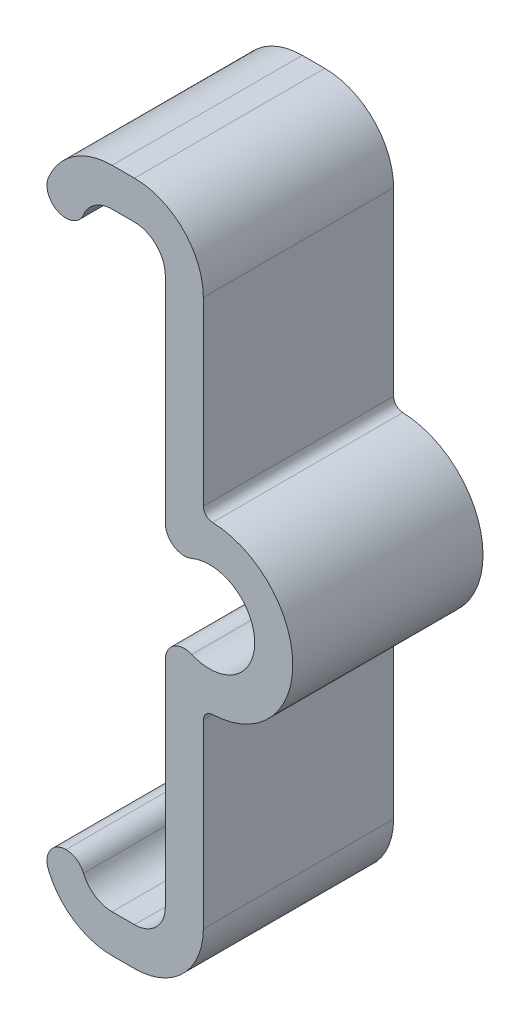
ISO-10303-21;
HEADER;
FILE_DESCRIPTION(('STEP AP214'),'2;1');
FILE_NAME('part.step','',(''),(''),'','','');
FILE_SCHEMA(('AUTOMOTIVE_DESIGN { 1 0 10303 214 1 1 1 1 }'));
ENDSEC;
DATA;
#1=APPLICATION_CONTEXT('core data for automotive mechanical design processes');
#2=APPLICATION_PROTOCOL_DEFINITION('international standard','automotive_design',2000,#1);
#3=PRODUCT_CONTEXT('',#1,'mechanical');
#4=PRODUCT('Part','Part','',(#3));
#5=PRODUCT_RELATED_PRODUCT_CATEGORY('part','',(#4));
#6=PRODUCT_DEFINITION_FORMATION('','',#4);
#7=PRODUCT_DEFINITION_CONTEXT('part definition',#1,'design');
#8=PRODUCT_DEFINITION('design','',#6,#7);
#9=PRODUCT_DEFINITION_SHAPE('','',#8);
#10=(LENGTH_UNIT() NAMED_UNIT(*) SI_UNIT(.MILLI.,.METRE.));
#11=(NAMED_UNIT(*) PLANE_ANGLE_UNIT() SI_UNIT($,.RADIAN.));
#12=(NAMED_UNIT(*) SI_UNIT($,.STERADIAN.) SOLID_ANGLE_UNIT());
#13=UNCERTAINTY_MEASURE_WITH_UNIT(LENGTH_MEASURE(1.E-05),#10,'distance_accuracy_value','');
#14=(GEOMETRIC_REPRESENTATION_CONTEXT(3) GLOBAL_UNCERTAINTY_ASSIGNED_CONTEXT((#13)) GLOBAL_UNIT_ASSIGNED_CONTEXT((#10,
#11,#12)) REPRESENTATION_CONTEXT('',''));
#15=CARTESIAN_POINT('',(0.,0.,0.));
#16=DIRECTION('',(0.,0.,1.));
#17=DIRECTION('',(1.,0.,0.));
#18=AXIS2_PLACEMENT_3D('',#15,#16,#17);
#19=CARTESIAN_POINT('',(0.,17.9899999999998,10.));
#20=DIRECTION('',(0.,-1.,0.));
#21=DIRECTION('',(1.,0.,0.));
#22=AXIS2_PLACEMENT_3D('',#19,#20,#21);
#23=PLANE('',#22);
#24=DIRECTION('',(-1.,0.,0.));
#25=VECTOR('',#24,1.);
#26=CARTESIAN_POINT('',(0.,17.9899999999998,0.));
#27=LINE('',#26,#25);
#28=CARTESIAN_POINT('',(-1.56999999999988,17.9899999999998,0.));
#29=VERTEX_POINT('',#28);
#30=CARTESIAN_POINT('',(-2.74800000000017,17.9899999999998,0.));
#31=VERTEX_POINT('',#30);
#32=EDGE_CURVE('E230',#29,#31,#27,.T.);
#33=ORIENTED_EDGE('',*,*,#32,.T.);
#34=DIRECTION('',(0.,0.,-1.));
#35=VECTOR('',#34,1.);
#36=CARTESIAN_POINT('',(-2.74800000000017,17.9899999999998,10.));
#37=LINE('',#36,#35);
#38=CARTESIAN_POINT('',(-2.74800000000017,17.9899999999998,10.));
#39=VERTEX_POINT('',#38);
#40=EDGE_CURVE('E213',#39,#31,#37,.T.);
#41=ORIENTED_EDGE('',*,*,#40,.F.);
#42=DIRECTION('',(-1.,0.,0.));
#43=VECTOR('',#42,1.);
#44=CARTESIAN_POINT('',(0.,17.9899999999998,10.));
#45=LINE('',#44,#43);
#46=CARTESIAN_POINT('',(-1.56999999999988,17.9899999999998,10.));
#47=VERTEX_POINT('',#46);
#48=EDGE_CURVE('E218',#47,#39,#45,.T.);
#49=ORIENTED_EDGE('',*,*,#48,.F.);
#50=DIRECTION('',(0.,0.,-1.));
#51=VECTOR('',#50,1.);
#52=CARTESIAN_POINT('',(-1.56999999999988,17.9899999999998,10.));
#53=LINE('',#52,#51);
#54=EDGE_CURVE('E342',#47,#29,#53,.T.);
#55=ORIENTED_EDGE('',*,*,#54,.T.);
#56=EDGE_LOOP('',(#33,#41,#49,#55));
#57=FACE_BOUND('',#56,.T.);
#58=ADVANCED_FACE('F35',(#57),#23,.F.);
#59=CARTESIAN_POINT('',(-2.74800000000055,14.37,10.));
#60=DIRECTION('',(0.,0.,-1.));
#61=DIRECTION('',(-1.,0.,0.));
#62=AXIS2_PLACEMENT_3D('',#59,#60,#61);
#63=CYLINDRICAL_SURFACE('',#62,3.61999999999977);
#64=CARTESIAN_POINT('',(-2.74800000000055,14.37,0.));
#65=DIRECTION('',(0.,0.,1.));
#66=DIRECTION('',(1.,0.,0.));
#67=AXIS2_PLACEMENT_3D('',#64,#65,#66);
#68=CIRCLE('',#67,3.61999999999977);
#69=CARTESIAN_POINT('',(-6.09394711033358,15.7516793893131,0.));
#70=VERTEX_POINT('',#69);
#71=EDGE_CURVE('E296',#31,#70,#68,.T.);
#72=ORIENTED_EDGE('',*,*,#71,.T.);
#73=DIRECTION('',(0.,0.,-1.));
#74=VECTOR('',#73,1.);
#75=CARTESIAN_POINT('',(-6.09394711033358,15.7516793893131,10.));
#76=LINE('',#75,#74);
#77=CARTESIAN_POINT('',(-6.09394711033358,15.7516793893131,10.));
#78=VERTEX_POINT('',#77);
#79=EDGE_CURVE('E216',#70,#78,#76,.F.);
#80=ORIENTED_EDGE('',*,*,#79,.T.);
#81=CARTESIAN_POINT('',(-2.74800000000055,14.37,10.));
#82=DIRECTION('',(0.,0.,1.));
#83=DIRECTION('',(1.,0.,0.));
#84=AXIS2_PLACEMENT_3D('',#81,#82,#83);
#85=CIRCLE('',#84,3.61999999999977);
#86=EDGE_CURVE('E208',#39,#78,#85,.T.);
#87=ORIENTED_EDGE('',*,*,#86,.F.);
#88=ORIENTED_EDGE('',*,*,#40,.T.);
#89=EDGE_LOOP('',(#72,#80,#87,#88));
#90=FACE_BOUND('',#89,.T.);
#91=ADVANCED_FACE('F211',(#90),#63,.T.);
#92=CARTESIAN_POINT('',(-2.74800000000056,14.37,10.));
#93=DIRECTION('',(0.,0.,-1.));
#94=DIRECTION('',(-1.,0.,0.));
#95=AXIS2_PLACEMENT_3D('',#92,#93,#94);
#96=CYLINDRICAL_SURFACE('',#95,1.61999999999978);
#97=CARTESIAN_POINT('',(-2.74800000000056,14.37,10.));
#98=DIRECTION('',(0.,0.,1.));
#99=DIRECTION('',(1.,0.,0.));
#100=AXIS2_PLACEMENT_3D('',#97,#98,#99);
#101=CIRCLE('',#100,1.61999999999978);
#102=CARTESIAN_POINT('',(-2.74800000000017,15.9899999999998,10.));
#103=VERTEX_POINT('',#102);
#104=CARTESIAN_POINT('',(-4.24535754661357,14.988320610687,10.));
#105=VERTEX_POINT('',#104);
#106=EDGE_CURVE('E217',#103,#105,#101,.T.);
#107=ORIENTED_EDGE('',*,*,#106,.T.);
#108=DIRECTION('',(0.,0.,-1.));
#109=VECTOR('',#108,1.);
#110=CARTESIAN_POINT('',(-4.24535754661357,14.988320610687,10.));
#111=LINE('',#110,#109);
#112=CARTESIAN_POINT('',(-4.24535754661357,14.988320610687,0.));
#113=VERTEX_POINT('',#112);
#114=EDGE_CURVE('E288',#105,#113,#111,.T.);
#115=ORIENTED_EDGE('',*,*,#114,.T.);
#116=CARTESIAN_POINT('',(-2.74800000000056,14.37,0.));
#117=DIRECTION('',(0.,0.,1.));
#118=DIRECTION('',(1.,0.,0.));
#119=AXIS2_PLACEMENT_3D('',#116,#117,#118);
#120=CIRCLE('',#119,1.61999999999978);
#121=CARTESIAN_POINT('',(-2.74800000000017,15.9899999999998,0.));
#122=VERTEX_POINT('',#121);
#123=EDGE_CURVE('E381',#122,#113,#120,.T.);
#124=ORIENTED_EDGE('',*,*,#123,.F.);
#125=DIRECTION('',(0.,0.,-1.));
#126=VECTOR('',#125,1.);
#127=CARTESIAN_POINT('',(-2.74800000000017,15.9899999999998,10.));
#128=LINE('',#127,#126);
#129=EDGE_CURVE('E232',#103,#122,#128,.T.);
#130=ORIENTED_EDGE('',*,*,#129,.F.);
#131=EDGE_LOOP('',(#107,#115,#124,#130));
#132=FACE_BOUND('',#131,.T.);
#133=ADVANCED_FACE('F518',(#132),#96,.F.);
#134=CARTESIAN_POINT('',(-6.59312728916929E-13,15.9899999999999,10.));
#135=DIRECTION('',(0.,-1.,0.));
#136=DIRECTION('',(1.,0.,0.));
#137=AXIS2_PLACEMENT_3D('',#134,#135,#136);
#138=PLANE('',#137);
#139=DIRECTION('',(-1.,0.,0.));
#140=VECTOR('',#139,1.);
#141=CARTESIAN_POINT('',(-6.59312728916929E-13,15.9899999999999,0.));
#142=LINE('',#141,#140);
#143=CARTESIAN_POINT('',(-1.56999999999988,15.9899999999999,0.));
#144=VERTEX_POINT('',#143);
#145=EDGE_CURVE('E377',#144,#122,#142,.T.);
#146=ORIENTED_EDGE('',*,*,#145,.F.);
#147=DIRECTION('',(0.,0.,-1.));
#148=VECTOR('',#147,1.);
#149=CARTESIAN_POINT('',(-1.56999999999988,15.9899999999999,10.));
#150=LINE('',#149,#148);
#151=CARTESIAN_POINT('',(-1.56999999999988,15.9899999999999,10.));
#152=VERTEX_POINT('',#151);
#153=EDGE_CURVE('E237',#152,#144,#150,.T.);
#154=ORIENTED_EDGE('',*,*,#153,.F.);
#155=DIRECTION('',(-1.,0.,0.));
#156=VECTOR('',#155,1.);
#157=CARTESIAN_POINT('',(-6.59312728916929E-13,15.9899999999999,10.));
#158=LINE('',#157,#156);
#159=EDGE_CURVE('E427',#152,#103,#158,.T.);
#160=ORIENTED_EDGE('',*,*,#159,.T.);
#161=ORIENTED_EDGE('',*,*,#129,.T.);
#162=EDGE_LOOP('',(#146,#154,#160,#161));
#163=FACE_BOUND('',#162,.T.);
#164=ADVANCED_FACE('F378',(#163),#138,.T.);
#165=CARTESIAN_POINT('',(-1.56999999999988,14.37,10.));
#166=DIRECTION('',(0.,0.,-1.));
#167=DIRECTION('',(-1.,0.,0.));
#168=AXIS2_PLACEMENT_3D('',#165,#166,#167);
#169=CYLINDRICAL_SURFACE('',#168,1.61999999999985);
#170=CARTESIAN_POINT('',(-1.56999999999988,14.37,0.));
#171=DIRECTION('',(0.,0.,1.));
#172=DIRECTION('',(1.,0.,0.));
#173=AXIS2_PLACEMENT_3D('',#170,#171,#172);
#174=CIRCLE('',#173,1.61999999999985);
#175=CARTESIAN_POINT('',(0.05,14.3700000000001,0.));
#176=VERTEX_POINT('',#175);
#177=EDGE_CURVE('E370',#176,#144,#174,.T.);
#178=ORIENTED_EDGE('',*,*,#177,.F.);
#179=DIRECTION('',(0.,0.,-1.));
#180=VECTOR('',#179,1.);
#181=CARTESIAN_POINT('',(0.05,14.3700000000001,10.));
#182=LINE('',#181,#180);
#183=CARTESIAN_POINT('',(0.05,14.3700000000001,10.));
#184=VERTEX_POINT('',#183);
#185=EDGE_CURVE('E361',#184,#176,#182,.T.);
#186=ORIENTED_EDGE('',*,*,#185,.F.);
#187=CARTESIAN_POINT('',(-1.56999999999988,14.37,10.));
#188=DIRECTION('',(0.,0.,1.));
#189=DIRECTION('',(1.,0.,0.));
#190=AXIS2_PLACEMENT_3D('',#187,#188,#189);
#191=CIRCLE('',#190,1.61999999999985);
#192=EDGE_CURVE('E372',#184,#152,#191,.T.);
#193=ORIENTED_EDGE('',*,*,#192,.T.);
#194=ORIENTED_EDGE('',*,*,#153,.T.);
#195=EDGE_LOOP('',(#178,#186,#193,#194));
#196=FACE_BOUND('',#195,.T.);
#197=ADVANCED_FACE('F367',(#196),#169,.F.);
#198=CARTESIAN_POINT('',(0.0499999999999965,0.,10.));
#199=DIRECTION('',(-1.,0.,0.));
#200=DIRECTION('',(0.,-1.,0.));
#201=AXIS2_PLACEMENT_3D('',#198,#199,#200);
#202=PLANE('',#201);
#203=DIRECTION('',(0.,1.,0.));
#204=VECTOR('',#203,1.);
#205=CARTESIAN_POINT('',(0.0499999999999965,0.,0.));
#206=LINE('',#205,#204);
#207=CARTESIAN_POINT('',(0.0499999999999972,3.10402963903375,0.));
#208=VERTEX_POINT('',#207);
#209=EDGE_CURVE('E384',#208,#176,#206,.T.);
#210=ORIENTED_EDGE('',*,*,#209,.F.);
#211=DIRECTION('',(0.,0.,-1.));
#212=VECTOR('',#211,1.);
#213=CARTESIAN_POINT('',(0.0499999999999972,3.10402963903375,10.));
#214=LINE('',#213,#212);
#215=CARTESIAN_POINT('',(0.0499999999999972,3.10402963903375,10.));
#216=VERTEX_POINT('',#215);
#217=EDGE_CURVE('E253',#208,#216,#214,.F.);
#218=ORIENTED_EDGE('',*,*,#217,.T.);
#219=DIRECTION('',(0.,1.,0.));
#220=VECTOR('',#219,1.);
#221=CARTESIAN_POINT('',(0.0499999999999965,0.,10.));
#222=LINE('',#221,#220);
#223=EDGE_CURVE('E426',#216,#184,#222,.T.);
#224=ORIENTED_EDGE('',*,*,#223,.T.);
#225=ORIENTED_EDGE('',*,*,#185,.T.);
#226=EDGE_LOOP('',(#210,#218,#224,#225));
#227=FACE_BOUND('',#226,.T.);
#228=ADVANCED_FACE('F424',(#227),#202,.T.);
#229=CARTESIAN_POINT('',(2.375,0.,10.));
#230=DIRECTION('',(0.,0.,-1.));
#231=DIRECTION('',(-1.,0.,0.));
#232=AXIS2_PLACEMENT_3D('',#229,#230,#231);
#233=CYLINDRICAL_SURFACE('',#232,2.375);
#234=CARTESIAN_POINT('',(2.375,0.,0.));
#235=DIRECTION('',(0.,0.,1.));
#236=DIRECTION('',(1.,0.,0.));
#237=AXIS2_PLACEMENT_3D('',#234,#235,#236);
#238=CIRCLE('',#237,2.375);
#239=CARTESIAN_POINT('',(1.44259259259259,-2.18431715339412,0.));
#240=VERTEX_POINT('',#239);
#241=CARTESIAN_POINT('',(1.44259259259259,2.18431715339412,0.));
#242=VERTEX_POINT('',#241);
#243=EDGE_CURVE('E386',#240,#242,#238,.T.);
#244=ORIENTED_EDGE('',*,*,#243,.F.);
#245=DIRECTION('',(0.,0.,-1.));
#246=VECTOR('',#245,1.);
#247=CARTESIAN_POINT('',(1.44259259259259,-2.18431715339412,10.));
#248=LINE('',#247,#246);
#249=CARTESIAN_POINT('',(1.44259259259259,-2.18431715339412,10.));
#250=VERTEX_POINT('',#249);
#251=EDGE_CURVE('E247',#240,#250,#248,.F.);
#252=ORIENTED_EDGE('',*,*,#251,.T.);
#253=CARTESIAN_POINT('',(2.375,0.,10.));
#254=DIRECTION('',(0.,0.,1.));
#255=DIRECTION('',(1.,0.,0.));
#256=AXIS2_PLACEMENT_3D('',#253,#254,#255);
#257=CIRCLE('',#256,2.375);
#258=CARTESIAN_POINT('',(1.44259259259259,2.18431715339412,10.));
#259=VERTEX_POINT('',#258);
#260=EDGE_CURVE('E418',#250,#259,#257,.T.);
#261=ORIENTED_EDGE('',*,*,#260,.T.);
#262=DIRECTION('',(0.,0.,-1.));
#263=VECTOR('',#262,1.);
#264=CARTESIAN_POINT('',(1.44259259259259,2.18431715339412,10.));
#265=LINE('',#264,#263);
#266=EDGE_CURVE('E244',#259,#242,#265,.T.);
#267=ORIENTED_EDGE('',*,*,#266,.T.);
#268=EDGE_LOOP('',(#244,#252,#261,#267));
#269=FACE_BOUND('',#268,.T.);
#270=ADVANCED_FACE('F414',(#269),#233,.F.);
#271=CARTESIAN_POINT('',(0.0499999999999965,0.,10.));
#272=DIRECTION('',(-1.,0.,0.));
#273=DIRECTION('',(0.,-1.,0.));
#274=AXIS2_PLACEMENT_3D('',#271,#272,#273);
#275=PLANE('',#274);
#276=DIRECTION('',(0.,1.,0.));
#277=VECTOR('',#276,1.);
#278=CARTESIAN_POINT('',(0.0499999999999965,0.,10.));
#279=LINE('',#278,#277);
#280=CARTESIAN_POINT('',(0.049999999999993,-14.3700000000001,10.));
#281=VERTEX_POINT('',#280);
#282=CARTESIAN_POINT('',(0.0499999999999957,-3.10402963903375,10.));
#283=VERTEX_POINT('',#282);
#284=EDGE_CURVE('E407',#281,#283,#279,.T.);
#285=ORIENTED_EDGE('',*,*,#284,.T.);
#286=DIRECTION('',(0.,0.,-1.));
#287=VECTOR('',#286,1.);
#288=CARTESIAN_POINT('',(0.0499999999999957,-3.10402963903375,10.));
#289=LINE('',#288,#287);
#290=CARTESIAN_POINT('',(0.0499999999999957,-3.10402963903375,0.));
#291=VERTEX_POINT('',#290);
#292=EDGE_CURVE('E231',#283,#291,#289,.T.);
#293=ORIENTED_EDGE('',*,*,#292,.T.);
#294=DIRECTION('',(0.,1.,0.));
#295=VECTOR('',#294,1.);
#296=CARTESIAN_POINT('',(0.0499999999999965,0.,0.));
#297=LINE('',#296,#295);
#298=CARTESIAN_POINT('',(0.049999999999993,-14.3700000000001,0.));
#299=VERTEX_POINT('',#298);
#300=EDGE_CURVE('E392',#299,#291,#297,.T.);
#301=ORIENTED_EDGE('',*,*,#300,.F.);
#302=DIRECTION('',(0.,0.,-1.));
#303=VECTOR('',#302,1.);
#304=CARTESIAN_POINT('',(0.049999999999993,-14.3700000000001,10.));
#305=LINE('',#304,#303);
#306=EDGE_CURVE('E359',#281,#299,#305,.T.);
#307=ORIENTED_EDGE('',*,*,#306,.F.);
#308=EDGE_LOOP('',(#285,#293,#301,#307));
#309=FACE_BOUND('',#308,.T.);
#310=ADVANCED_FACE('F405',(#309),#275,.T.);
#311=CARTESIAN_POINT('',(-1.57000000000018,-14.3700000000001,10.));
#312=DIRECTION('',(0.,0.,-1.));
#313=DIRECTION('',(-1.,0.,0.));
#314=AXIS2_PLACEMENT_3D('',#311,#312,#313);
#315=CYLINDRICAL_SURFACE('',#314,1.62000000000017);
#316=CARTESIAN_POINT('',(-1.57000000000018,-14.3700000000001,0.));
#317=DIRECTION('',(0.,0.,1.));
#318=DIRECTION('',(1.,0.,0.));
#319=AXIS2_PLACEMENT_3D('',#316,#317,#318);
#320=CIRCLE('',#319,1.62000000000017);
#321=CARTESIAN_POINT('',(-1.57000000000015,-15.9900000000003,0.));
#322=VERTEX_POINT('',#321);
#323=EDGE_CURVE('E326',#322,#299,#320,.T.);
#324=ORIENTED_EDGE('',*,*,#323,.F.);
#325=DIRECTION('',(0.,0.,-1.));
#326=VECTOR('',#325,1.);
#327=CARTESIAN_POINT('',(-1.57000000000015,-15.9900000000003,10.));
#328=LINE('',#327,#326);
#329=CARTESIAN_POINT('',(-1.57000000000015,-15.9900000000003,10.));
#330=VERTEX_POINT('',#329);
#331=EDGE_CURVE('E357',#330,#322,#328,.T.);
#332=ORIENTED_EDGE('',*,*,#331,.F.);
#333=CARTESIAN_POINT('',(-1.57000000000018,-14.3700000000001,10.));
#334=DIRECTION('',(0.,0.,1.));
#335=DIRECTION('',(1.,0.,0.));
#336=AXIS2_PLACEMENT_3D('',#333,#334,#335);
#337=CIRCLE('',#336,1.62000000000017);
#338=EDGE_CURVE('E401',#330,#281,#337,.T.);
#339=ORIENTED_EDGE('',*,*,#338,.T.);
#340=ORIENTED_EDGE('',*,*,#306,.T.);
#341=EDGE_LOOP('',(#324,#332,#339,#340));
#342=FACE_BOUND('',#341,.T.);
#343=ADVANCED_FACE('F398',(#342),#315,.F.);
#344=CARTESIAN_POINT('',(0.,-15.9900000000003,10.));
#345=DIRECTION('',(0.,1.,0.));
#346=DIRECTION('',(0.,0.,1.));
#347=AXIS2_PLACEMENT_3D('',#344,#345,#346);
#348=PLANE('',#347);
#349=DIRECTION('',(1.,0.,0.));
#350=VECTOR('',#349,1.);
#351=CARTESIAN_POINT('',(0.,-15.9900000000003,0.));
#352=LINE('',#351,#350);
#353=CARTESIAN_POINT('',(-2.74799999999983,-15.9900000000003,0.));
#354=VERTEX_POINT('',#353);
#355=EDGE_CURVE('E322',#354,#322,#352,.T.);
#356=ORIENTED_EDGE('',*,*,#355,.F.);
#357=DIRECTION('',(0.,0.,-1.));
#358=VECTOR('',#357,1.);
#359=CARTESIAN_POINT('',(-2.74799999999983,-15.9900000000003,10.));
#360=LINE('',#359,#358);
#361=CARTESIAN_POINT('',(-2.74799999999983,-15.9900000000003,10.));
#362=VERTEX_POINT('',#361);
#363=EDGE_CURVE('E319',#362,#354,#360,.T.);
#364=ORIENTED_EDGE('',*,*,#363,.F.);
#365=DIRECTION('',(1.,0.,0.));
#366=VECTOR('',#365,1.);
#367=CARTESIAN_POINT('',(0.,-15.9900000000003,10.));
#368=LINE('',#367,#366);
#369=EDGE_CURVE('E436',#362,#330,#368,.T.);
#370=ORIENTED_EDGE('',*,*,#369,.T.);
#371=ORIENTED_EDGE('',*,*,#331,.T.);
#372=EDGE_LOOP('',(#356,#364,#370,#371));
#373=FACE_BOUND('',#372,.T.);
#374=ADVANCED_FACE('F504',(#373),#348,.T.);
#375=CARTESIAN_POINT('',(-2.74799999999983,-14.3700000000001,10.));
#376=DIRECTION('',(0.,0.,-1.));
#377=DIRECTION('',(-1.,0.,0.));
#378=AXIS2_PLACEMENT_3D('',#375,#376,#377);
#379=CYLINDRICAL_SURFACE('',#378,1.62000000000016);
#380=CARTESIAN_POINT('',(-2.74799999999983,-14.3700000000001,0.));
#381=DIRECTION('',(0.,0.,1.));
#382=DIRECTION('',(1.,0.,0.));
#383=AXIS2_PLACEMENT_3D('',#380,#381,#382);
#384=CIRCLE('',#383,1.62000000000016);
#385=CARTESIAN_POINT('',(-4.24535754661323,-14.9883206106872,0.));
#386=VERTEX_POINT('',#385);
#387=EDGE_CURVE('E312',#386,#354,#384,.T.);
#388=ORIENTED_EDGE('',*,*,#387,.F.);
#389=DIRECTION('',(0.,0.,-1.));
#390=VECTOR('',#389,1.);
#391=CARTESIAN_POINT('',(-4.24535754661323,-14.9883206106872,10.));
#392=LINE('',#391,#390);
#393=CARTESIAN_POINT('',(-4.24535754661323,-14.9883206106872,10.));
#394=VERTEX_POINT('',#393);
#395=EDGE_CURVE('E11',#386,#394,#392,.F.);
#396=ORIENTED_EDGE('',*,*,#395,.T.);
#397=CARTESIAN_POINT('',(-2.74799999999983,-14.3700000000001,10.));
#398=DIRECTION('',(0.,0.,1.));
#399=DIRECTION('',(1.,0.,0.));
#400=AXIS2_PLACEMENT_3D('',#397,#398,#399);
#401=CIRCLE('',#400,1.62000000000016);
#402=EDGE_CURVE('E439',#394,#362,#401,.T.);
#403=ORIENTED_EDGE('',*,*,#402,.T.);
#404=ORIENTED_EDGE('',*,*,#363,.T.);
#405=EDGE_LOOP('',(#388,#396,#403,#404));
#406=FACE_BOUND('',#405,.T.);
#407=ADVANCED_FACE('F316',(#406),#379,.F.);
#408=CARTESIAN_POINT('',(-2.74799999999983,-14.3700000000001,10.));
#409=DIRECTION('',(0.,0.,-1.));
#410=DIRECTION('',(-1.,0.,0.));
#411=AXIS2_PLACEMENT_3D('',#408,#409,#410);
#412=CYLINDRICAL_SURFACE('',#411,3.62000000000015);
#413=CARTESIAN_POINT('',(-2.74799999999983,-14.3700000000001,10.));
#414=DIRECTION('',(0.,0.,1.));
#415=DIRECTION('',(1.,0.,0.));
#416=AXIS2_PLACEMENT_3D('',#413,#414,#415);
#417=CIRCLE('',#416,3.62000000000015);
#418=CARTESIAN_POINT('',(-6.0939471103333,-15.7516793893131,10.));
#419=VERTEX_POINT('',#418);
#420=CARTESIAN_POINT('',(-2.74799999999983,-17.9900000000003,10.));
#421=VERTEX_POINT('',#420);
#422=EDGE_CURVE('E441',#419,#421,#417,.T.);
#423=ORIENTED_EDGE('',*,*,#422,.F.);
#424=DIRECTION('',(0.,0.,-1.));
#425=VECTOR('',#424,1.);
#426=CARTESIAN_POINT('',(-6.0939471103333,-15.7516793893131,10.));
#427=LINE('',#426,#425);
#428=CARTESIAN_POINT('',(-6.0939471103333,-15.7516793893131,0.));
#429=VERTEX_POINT('',#428);
#430=EDGE_CURVE('E44',#419,#429,#427,.T.);
#431=ORIENTED_EDGE('',*,*,#430,.T.);
#432=CARTESIAN_POINT('',(-2.74799999999983,-14.3700000000001,0.));
#433=DIRECTION('',(0.,0.,1.));
#434=DIRECTION('',(1.,0.,0.));
#435=AXIS2_PLACEMENT_3D('',#432,#433,#434);
#436=CIRCLE('',#435,3.62000000000015);
#437=CARTESIAN_POINT('',(-2.74799999999983,-17.9900000000003,0.));
#438=VERTEX_POINT('',#437);
#439=EDGE_CURVE('E321',#429,#438,#436,.T.);
#440=ORIENTED_EDGE('',*,*,#439,.T.);
#441=DIRECTION('',(0.,0.,-1.));
#442=VECTOR('',#441,1.);
#443=CARTESIAN_POINT('',(-2.74799999999983,-17.9900000000003,10.));
#444=LINE('',#443,#442);
#445=EDGE_CURVE('E353',#421,#438,#444,.T.);
#446=ORIENTED_EDGE('',*,*,#445,.F.);
#447=EDGE_LOOP('',(#423,#431,#440,#446));
#448=FACE_BOUND('',#447,.T.);
#449=ADVANCED_FACE('F501',(#448),#412,.T.);
#450=CARTESIAN_POINT('',(0.,-17.9900000000003,10.));
#451=DIRECTION('',(0.,1.,0.));
#452=DIRECTION('',(0.,0.,1.));
#453=AXIS2_PLACEMENT_3D('',#450,#451,#452);
#454=PLANE('',#453);
#455=DIRECTION('',(1.,0.,0.));
#456=VECTOR('',#455,1.);
#457=CARTESIAN_POINT('',(0.,-17.9900000000003,0.));
#458=LINE('',#457,#456);
#459=CARTESIAN_POINT('',(-1.57000000000015,-17.9900000000003,0.));
#460=VERTEX_POINT('',#459);
#461=EDGE_CURVE('E324',#438,#460,#458,.T.);
#462=ORIENTED_EDGE('',*,*,#461,.T.);
#463=DIRECTION('',(0.,0.,-1.));
#464=VECTOR('',#463,1.);
#465=CARTESIAN_POINT('',(-1.57000000000015,-17.9900000000003,10.));
#466=LINE('',#465,#464);
#467=CARTESIAN_POINT('',(-1.57000000000015,-17.9900000000003,10.));
#468=VERTEX_POINT('',#467);
#469=EDGE_CURVE('E350',#468,#460,#466,.T.);
#470=ORIENTED_EDGE('',*,*,#469,.F.);
#471=DIRECTION('',(1.,0.,0.));
#472=VECTOR('',#471,1.);
#473=CARTESIAN_POINT('',(0.,-17.9900000000003,10.));
#474=LINE('',#473,#472);
#475=EDGE_CURVE('E443',#421,#468,#474,.T.);
#476=ORIENTED_EDGE('',*,*,#475,.F.);
#477=ORIENTED_EDGE('',*,*,#445,.T.);
#478=EDGE_LOOP('',(#462,#470,#476,#477));
#479=FACE_BOUND('',#478,.T.);
#480=ADVANCED_FACE('F496',(#479),#454,.F.);
#481=CARTESIAN_POINT('',(-1.57000000000018,-14.3700000000001,10.));
#482=DIRECTION('',(0.,0.,-1.));
#483=DIRECTION('',(-1.,0.,0.));
#484=AXIS2_PLACEMENT_3D('',#481,#482,#483);
#485=CYLINDRICAL_SURFACE('',#484,3.62000000000017);
#486=CARTESIAN_POINT('',(-1.57000000000018,-14.3700000000001,0.));
#487=DIRECTION('',(0.,0.,1.));
#488=DIRECTION('',(1.,0.,0.));
#489=AXIS2_PLACEMENT_3D('',#486,#487,#488);
#490=CIRCLE('',#489,3.62000000000017);
#491=CARTESIAN_POINT('',(2.04999999999999,-14.3700000000001,0.));
#492=VERTEX_POINT('',#491);
#493=EDGE_CURVE('E331',#460,#492,#490,.T.);
#494=ORIENTED_EDGE('',*,*,#493,.T.);
#495=DIRECTION('',(0.,0.,-1.));
#496=VECTOR('',#495,1.);
#497=CARTESIAN_POINT('',(2.04999999999999,-14.3700000000001,10.));
#498=LINE('',#497,#496);
#499=CARTESIAN_POINT('',(2.04999999999999,-14.3700000000001,10.));
#500=VERTEX_POINT('',#499);
#501=EDGE_CURVE('E347',#500,#492,#498,.T.);
#502=ORIENTED_EDGE('',*,*,#501,.F.);
#503=CARTESIAN_POINT('',(-1.57000000000018,-14.3700000000001,10.));
#504=DIRECTION('',(0.,0.,1.));
#505=DIRECTION('',(1.,0.,0.));
#506=AXIS2_PLACEMENT_3D('',#503,#504,#505);
#507=CIRCLE('',#506,3.62000000000017);
#508=EDGE_CURVE('E445',#468,#500,#507,.T.);
#509=ORIENTED_EDGE('',*,*,#508,.F.);
#510=ORIENTED_EDGE('',*,*,#469,.T.);
#511=EDGE_LOOP('',(#494,#502,#509,#510));
#512=FACE_BOUND('',#511,.T.);
#513=ADVANCED_FACE('F492',(#512),#485,.T.);
#514=CARTESIAN_POINT('',(2.04999999999997,0.,10.));
#515=DIRECTION('',(-1.,0.,0.));
#516=DIRECTION('',(0.,-1.,0.));
#517=AXIS2_PLACEMENT_3D('',#514,#515,#516);
#518=PLANE('',#517);
#519=DIRECTION('',(0.,1.,0.));
#520=VECTOR('',#519,1.);
#521=CARTESIAN_POINT('',(2.04999999999997,0.,0.));
#522=LINE('',#521,#520);
#523=CARTESIAN_POINT('',(2.04999999999998,-4.87185796180472,0.));
#524=VERTEX_POINT('',#523);
#525=EDGE_CURVE('E333',#492,#524,#522,.T.);
#526=ORIENTED_EDGE('',*,*,#525,.T.);
#527=DIRECTION('',(0.,0.,1.));
#528=VECTOR('',#527,1.);
#529=CARTESIAN_POINT('',(2.04999999999998,-4.87185796180472,10.));
#530=LINE('',#529,#528);
#531=CARTESIAN_POINT('',(2.04999999999998,-4.87185796180472,10.));
#532=VERTEX_POINT('',#531);
#533=EDGE_CURVE('E260',#524,#532,#530,.T.);
#534=ORIENTED_EDGE('',*,*,#533,.T.);
#535=DIRECTION('',(0.,1.,0.));
#536=VECTOR('',#535,1.);
#537=CARTESIAN_POINT('',(2.04999999999997,0.,10.));
#538=LINE('',#537,#536);
#539=EDGE_CURVE('E447',#500,#532,#538,.T.);
#540=ORIENTED_EDGE('',*,*,#539,.F.);
#541=ORIENTED_EDGE('',*,*,#501,.T.);
#542=EDGE_LOOP('',(#526,#534,#540,#541));
#543=FACE_BOUND('',#542,.T.);
#544=ADVANCED_FACE('F487',(#543),#518,.F.);
#545=CARTESIAN_POINT('',(2.375,0.,10.));
#546=DIRECTION('',(0.,0.,-1.));
#547=DIRECTION('',(-1.,0.,0.));
#548=AXIS2_PLACEMENT_3D('',#545,#546,#547);
#549=CYLINDRICAL_SURFACE('',#548,4.375);
#550=CARTESIAN_POINT('',(2.375,0.,10.));
#551=DIRECTION('',(0.,0.,1.));
#552=DIRECTION('',(1.,0.,0.));
#553=AXIS2_PLACEMENT_3D('',#550,#551,#552);
#554=CIRCLE('',#553,4.375);
#555=CARTESIAN_POINT('',(2.53205128205126,-4.37218022213244,10.));
#556=VERTEX_POINT('',#555);
#557=CARTESIAN_POINT('',(2.53205128205125,4.37218022213244,10.));
#558=VERTEX_POINT('',#557);
#559=EDGE_CURVE('E450',#556,#558,#554,.T.);
#560=ORIENTED_EDGE('',*,*,#559,.F.);
#561=DIRECTION('',(0.,0.,-1.));
#562=VECTOR('',#561,1.);
#563=CARTESIAN_POINT('',(2.53205128205126,-4.37218022213244,10.));
#564=LINE('',#563,#562);
#565=CARTESIAN_POINT('',(2.53205128205126,-4.37218022213244,0.));
#566=VERTEX_POINT('',#565);
#567=EDGE_CURVE('E257',#556,#566,#564,.T.);
#568=ORIENTED_EDGE('',*,*,#567,.T.);
#569=CARTESIAN_POINT('',(2.375,0.,0.));
#570=DIRECTION('',(0.,0.,1.));
#571=DIRECTION('',(1.,0.,0.));
#572=AXIS2_PLACEMENT_3D('',#569,#570,#571);
#573=CIRCLE('',#572,4.375);
#574=CARTESIAN_POINT('',(2.53205128205125,4.37218022213244,0.));
#575=VERTEX_POINT('',#574);
#576=EDGE_CURVE('E336',#566,#575,#573,.T.);
#577=ORIENTED_EDGE('',*,*,#576,.T.);
#578=DIRECTION('',(0.,0.,-1.));
#579=VECTOR('',#578,1.);
#580=CARTESIAN_POINT('',(2.53205128205125,4.37218022213244,10.));
#581=LINE('',#580,#579);
#582=EDGE_CURVE('E255',#575,#558,#581,.F.);
#583=ORIENTED_EDGE('',*,*,#582,.T.);
#584=EDGE_LOOP('',(#560,#568,#577,#583));
#585=FACE_BOUND('',#584,.T.);
#586=ADVANCED_FACE('F478',(#585),#549,.T.);
#587=CARTESIAN_POINT('',(2.04999999999997,0.,10.));
#588=DIRECTION('',(-1.,0.,0.));
#589=DIRECTION('',(0.,-1.,0.));
#590=AXIS2_PLACEMENT_3D('',#587,#588,#589);
#591=PLANE('',#590);
#592=DIRECTION('',(0.,1.,0.));
#593=VECTOR('',#592,1.);
#594=CARTESIAN_POINT('',(2.04999999999997,0.,10.));
#595=LINE('',#594,#593);
#596=CARTESIAN_POINT('',(2.04999999999997,4.87185796180472,10.));
#597=VERTEX_POINT('',#596);
#598=CARTESIAN_POINT('',(2.04999999999995,14.3700000000001,10.));
#599=VERTEX_POINT('',#598);
#600=EDGE_CURVE('E453',#597,#599,#595,.T.);
#601=ORIENTED_EDGE('',*,*,#600,.F.);
#602=DIRECTION('',(0.,0.,1.));
#603=VECTOR('',#602,1.);
#604=CARTESIAN_POINT('',(2.04999999999997,4.87185796180472,0.));
#605=LINE('',#604,#603);
#606=CARTESIAN_POINT('',(2.04999999999997,4.87185796180472,0.));
#607=VERTEX_POINT('',#606);
#608=EDGE_CURVE('E262',#597,#607,#605,.F.);
#609=ORIENTED_EDGE('',*,*,#608,.T.);
#610=DIRECTION('',(0.,1.,0.));
#611=VECTOR('',#610,1.);
#612=CARTESIAN_POINT('',(2.04999999999997,0.,0.));
#613=LINE('',#612,#611);
#614=CARTESIAN_POINT('',(2.04999999999995,14.3700000000001,0.));
#615=VERTEX_POINT('',#614);
#616=EDGE_CURVE('E339',#607,#615,#613,.T.);
#617=ORIENTED_EDGE('',*,*,#616,.T.);
#618=DIRECTION('',(0.,0.,-1.));
#619=VECTOR('',#618,1.);
#620=CARTESIAN_POINT('',(2.04999999999995,14.3700000000001,10.));
#621=LINE('',#620,#619);
#622=EDGE_CURVE('E344',#599,#615,#621,.T.);
#623=ORIENTED_EDGE('',*,*,#622,.F.);
#624=EDGE_LOOP('',(#601,#609,#617,#623));
#625=FACE_BOUND('',#624,.T.);
#626=ADVANCED_FACE('F469',(#625),#591,.F.);
#627=CARTESIAN_POINT('',(-1.56999999999988,14.37,10.));
#628=DIRECTION('',(0.,0.,-1.));
#629=DIRECTION('',(-1.,0.,0.));
#630=AXIS2_PLACEMENT_3D('',#627,#628,#629);
#631=CYLINDRICAL_SURFACE('',#630,3.61999999999983);
#632=CARTESIAN_POINT('',(-1.56999999999988,14.37,0.));
#633=DIRECTION('',(0.,0.,1.));
#634=DIRECTION('',(1.,0.,0.));
#635=AXIS2_PLACEMENT_3D('',#632,#633,#634);
#636=CIRCLE('',#635,3.61999999999983);
#637=EDGE_CURVE('E227',#615,#29,#636,.T.);
#638=ORIENTED_EDGE('',*,*,#637,.T.);
#639=ORIENTED_EDGE('',*,*,#54,.F.);
#640=CARTESIAN_POINT('',(-1.56999999999988,14.37,10.));
#641=DIRECTION('',(0.,0.,1.));
#642=DIRECTION('',(1.,0.,0.));
#643=AXIS2_PLACEMENT_3D('',#640,#641,#642);
#644=CIRCLE('',#643,3.61999999999983);
#645=EDGE_CURVE('E223',#599,#47,#644,.T.);
#646=ORIENTED_EDGE('',*,*,#645,.F.);
#647=ORIENTED_EDGE('',*,*,#622,.T.);
#648=EDGE_LOOP('',(#638,#639,#646,#647));
#649=FACE_BOUND('',#648,.T.);
#650=ADVANCED_FACE('F465',(#649),#631,.T.);
#651=CARTESIAN_POINT('',(0.,0.,10.));
#652=DIRECTION('',(0.,0.,1.));
#653=DIRECTION('',(1.,0.,0.));
#654=AXIS2_PLACEMENT_3D('',#651,#652,#653);
#655=PLANE('',#654);
#656=ORIENTED_EDGE('',*,*,#86,.T.);
#657=CARTESIAN_POINT('',(-5.16965232847357,15.37,10.));
#658=DIRECTION('',(0.,0.,1.));
#659=DIRECTION('',(1.,0.,0.));
#660=AXIS2_PLACEMENT_3D('',#657,#658,#659);
#661=CIRCLE('',#660,1.);
#662=CARTESIAN_POINT('',(-5.16965232847358,14.37,10.));
#663=VERTEX_POINT('',#662);
#664=EDGE_CURVE('E57',#78,#663,#661,.T.);
#665=ORIENTED_EDGE('',*,*,#664,.T.);
#666=CARTESIAN_POINT('',(-5.16965232847358,15.37,10.));
#667=DIRECTION('',(0.,0.,1.));
#668=DIRECTION('',(1.,0.,0.));
#669=AXIS2_PLACEMENT_3D('',#666,#667,#668);
#670=CIRCLE('',#669,1.);
#671=EDGE_CURVE('E52',#663,#105,#670,.T.);
#672=ORIENTED_EDGE('',*,*,#671,.T.);
#673=ORIENTED_EDGE('',*,*,#106,.F.);
#674=ORIENTED_EDGE('',*,*,#159,.F.);
#675=ORIENTED_EDGE('',*,*,#192,.F.);
#676=ORIENTED_EDGE('',*,*,#223,.F.);
#677=CARTESIAN_POINT('',(1.05,3.10402963903375,10.));
#678=DIRECTION('',(0.,0.,1.));
#679=DIRECTION('',(1.,0.,0.));
#680=AXIS2_PLACEMENT_3D('',#677,#678,#679);
#681=CIRCLE('',#680,1.);
#682=EDGE_CURVE('E249',#216,#259,#681,.T.);
#683=ORIENTED_EDGE('',*,*,#682,.T.);
#684=ORIENTED_EDGE('',*,*,#260,.F.);
#685=CARTESIAN_POINT('',(1.05,-3.10402963903375,10.));
#686=DIRECTION('',(0.,0.,1.));
#687=DIRECTION('',(1.,0.,0.));
#688=AXIS2_PLACEMENT_3D('',#685,#686,#687);
#689=CIRCLE('',#688,1.);
#690=EDGE_CURVE('E251',#250,#283,#689,.T.);
#691=ORIENTED_EDGE('',*,*,#690,.T.);
#692=ORIENTED_EDGE('',*,*,#284,.F.);
#693=ORIENTED_EDGE('',*,*,#338,.F.);
#694=ORIENTED_EDGE('',*,*,#369,.F.);
#695=ORIENTED_EDGE('',*,*,#402,.F.);
#696=CARTESIAN_POINT('',(-5.16965232847327,-15.3700000000001,10.));
#697=DIRECTION('',(0.,0.,1.));
#698=DIRECTION('',(1.,0.,0.));
#699=AXIS2_PLACEMENT_3D('',#696,#697,#698);
#700=CIRCLE('',#699,1.);
#701=CARTESIAN_POINT('',(-5.16965232847327,-14.3700000000001,10.));
#702=VERTEX_POINT('',#701);
#703=EDGE_CURVE('E282',#394,#702,#700,.T.);
#704=ORIENTED_EDGE('',*,*,#703,.T.);
#705=CARTESIAN_POINT('',(-5.16965232847327,-15.3700000000001,10.));
#706=DIRECTION('',(0.,0.,1.));
#707=DIRECTION('',(1.,0.,0.));
#708=AXIS2_PLACEMENT_3D('',#705,#706,#707);
#709=CIRCLE('',#708,1.);
#710=EDGE_CURVE('E284',#702,#419,#709,.T.);
#711=ORIENTED_EDGE('',*,*,#710,.T.);
#712=ORIENTED_EDGE('',*,*,#422,.T.);
#713=ORIENTED_EDGE('',*,*,#475,.T.);
#714=ORIENTED_EDGE('',*,*,#508,.T.);
#715=ORIENTED_EDGE('',*,*,#539,.T.);
#716=CARTESIAN_POINT('',(2.54999999999998,-4.87185796180472,10.));
#717=DIRECTION('',(0.,0.,1.));
#718=DIRECTION('',(1.,0.,0.));
#719=AXIS2_PLACEMENT_3D('',#716,#717,#718);
#720=CIRCLE('',#719,0.5);
#721=EDGE_CURVE('E267',#532,#556,#720,.F.);
#722=ORIENTED_EDGE('',*,*,#721,.T.);
#723=ORIENTED_EDGE('',*,*,#559,.T.);
#724=CARTESIAN_POINT('',(2.54999999999997,4.87185796180472,10.));
#725=DIRECTION('',(0.,0.,1.));
#726=DIRECTION('',(1.,0.,0.));
#727=AXIS2_PLACEMENT_3D('',#724,#725,#726);
#728=CIRCLE('',#727,0.5);
#729=EDGE_CURVE('E271',#558,#597,#728,.F.);
#730=ORIENTED_EDGE('',*,*,#729,.T.);
#731=ORIENTED_EDGE('',*,*,#600,.T.);
#732=ORIENTED_EDGE('',*,*,#645,.T.);
#733=ORIENTED_EDGE('',*,*,#48,.T.);
#734=EDGE_LOOP('',(#656,#665,#672,#673,#674,#675,#676,#683,#684,#691,#692,#693,#694,#695,#704,
#711,#712,#713,#714,#715,#722,#723,#730,#731,#732,#733));
#735=FACE_BOUND('',#734,.T.);
#736=ADVANCED_FACE('F221',(#735),#655,.T.);
#737=CARTESIAN_POINT('',(0.,0.,0.));
#738=DIRECTION('',(0.,0.,1.));
#739=DIRECTION('',(1.,0.,0.));
#740=AXIS2_PLACEMENT_3D('',#737,#738,#739);
#741=PLANE('',#740);
#742=CARTESIAN_POINT('',(-5.16965232847358,15.37,0.));
#743=DIRECTION('',(0.,0.,1.));
#744=DIRECTION('',(1.,0.,0.));
#745=AXIS2_PLACEMENT_3D('',#742,#743,#744);
#746=CIRCLE('',#745,1.);
#747=CARTESIAN_POINT('',(-5.16965232847358,14.37,0.));
#748=VERTEX_POINT('',#747);
#749=EDGE_CURVE('E277',#113,#748,#746,.F.);
#750=ORIENTED_EDGE('',*,*,#749,.T.);
#751=CARTESIAN_POINT('',(-5.16965232847357,15.37,0.));
#752=DIRECTION('',(0.,0.,1.));
#753=DIRECTION('',(1.,0.,0.));
#754=AXIS2_PLACEMENT_3D('',#751,#752,#753);
#755=CIRCLE('',#754,1.);
#756=EDGE_CURVE('E279',#748,#70,#755,.F.);
#757=ORIENTED_EDGE('',*,*,#756,.T.);
#758=ORIENTED_EDGE('',*,*,#71,.F.);
#759=ORIENTED_EDGE('',*,*,#32,.F.);
#760=ORIENTED_EDGE('',*,*,#637,.F.);
#761=ORIENTED_EDGE('',*,*,#616,.F.);
#762=CARTESIAN_POINT('',(2.54999999999997,4.87185796180472,0.));
#763=DIRECTION('',(0.,0.,1.));
#764=DIRECTION('',(1.,0.,0.));
#765=AXIS2_PLACEMENT_3D('',#762,#763,#764);
#766=CIRCLE('',#765,0.5);
#767=EDGE_CURVE('E269',#607,#575,#766,.T.);
#768=ORIENTED_EDGE('',*,*,#767,.T.);
#769=ORIENTED_EDGE('',*,*,#576,.F.);
#770=CARTESIAN_POINT('',(2.54999999999998,-4.87185796180472,0.));
#771=DIRECTION('',(0.,0.,1.));
#772=DIRECTION('',(1.,0.,0.));
#773=AXIS2_PLACEMENT_3D('',#770,#771,#772);
#774=CIRCLE('',#773,0.5);
#775=EDGE_CURVE('E265',#566,#524,#774,.T.);
#776=ORIENTED_EDGE('',*,*,#775,.T.);
#777=ORIENTED_EDGE('',*,*,#525,.F.);
#778=ORIENTED_EDGE('',*,*,#493,.F.);
#779=ORIENTED_EDGE('',*,*,#461,.F.);
#780=ORIENTED_EDGE('',*,*,#439,.F.);
#781=CARTESIAN_POINT('',(-5.16965232847327,-15.3700000000001,0.));
#782=DIRECTION('',(0.,0.,1.));
#783=DIRECTION('',(1.,0.,0.));
#784=AXIS2_PLACEMENT_3D('',#781,#782,#783);
#785=CIRCLE('',#784,1.);
#786=CARTESIAN_POINT('',(-5.16965232847327,-14.3700000000001,0.));
#787=VERTEX_POINT('',#786);
#788=EDGE_CURVE('E275',#429,#787,#785,.F.);
#789=ORIENTED_EDGE('',*,*,#788,.T.);
#790=CARTESIAN_POINT('',(-5.16965232847327,-15.3700000000001,0.));
#791=DIRECTION('',(0.,0.,1.));
#792=DIRECTION('',(1.,0.,0.));
#793=AXIS2_PLACEMENT_3D('',#790,#791,#792);
#794=CIRCLE('',#793,1.);
#795=EDGE_CURVE('E273',#787,#386,#794,.F.);
#796=ORIENTED_EDGE('',*,*,#795,.T.);
#797=ORIENTED_EDGE('',*,*,#387,.T.);
#798=ORIENTED_EDGE('',*,*,#355,.T.);
#799=ORIENTED_EDGE('',*,*,#323,.T.);
#800=ORIENTED_EDGE('',*,*,#300,.T.);
#801=CARTESIAN_POINT('',(1.05,-3.10402963903375,0.));
#802=DIRECTION('',(0.,0.,1.));
#803=DIRECTION('',(1.,0.,0.));
#804=AXIS2_PLACEMENT_3D('',#801,#802,#803);
#805=CIRCLE('',#804,1.);
#806=EDGE_CURVE('E242',#291,#240,#805,.F.);
#807=ORIENTED_EDGE('',*,*,#806,.T.);
#808=ORIENTED_EDGE('',*,*,#243,.T.);
#809=CARTESIAN_POINT('',(1.05,3.10402963903375,0.));
#810=DIRECTION('',(0.,0.,1.));
#811=DIRECTION('',(1.,0.,0.));
#812=AXIS2_PLACEMENT_3D('',#809,#810,#811);
#813=CIRCLE('',#812,1.);
#814=EDGE_CURVE('E235',#242,#208,#813,.F.);
#815=ORIENTED_EDGE('',*,*,#814,.T.);
#816=ORIENTED_EDGE('',*,*,#209,.T.);
#817=ORIENTED_EDGE('',*,*,#177,.T.);
#818=ORIENTED_EDGE('',*,*,#145,.T.);
#819=ORIENTED_EDGE('',*,*,#123,.T.);
#820=EDGE_LOOP('',(#750,#757,#758,#759,#760,#761,#768,#769,#776,#777,#778,#779,#780,#789,#796,
#797,#798,#799,#800,#807,#808,#815,#816,#817,#818,#819));
#821=FACE_BOUND('',#820,.T.);
#822=ADVANCED_FACE('F310',(#821),#741,.F.);
#823=CARTESIAN_POINT('',(1.05,-3.10402963903375,10.));
#824=DIRECTION('',(0.,0.,-1.));
#825=DIRECTION('',(-1.,0.,0.));
#826=AXIS2_PLACEMENT_3D('',#823,#824,#825);
#827=CYLINDRICAL_SURFACE('',#826,1.);
#828=ORIENTED_EDGE('',*,*,#690,.F.);
#829=ORIENTED_EDGE('',*,*,#251,.F.);
#830=ORIENTED_EDGE('',*,*,#806,.F.);
#831=ORIENTED_EDGE('',*,*,#292,.F.);
#832=EDGE_LOOP('',(#828,#829,#830,#831));
#833=FACE_BOUND('',#832,.T.);
#834=ADVANCED_FACE('F410',(#833),#827,.T.);
#835=CARTESIAN_POINT('',(1.05,3.10402963903375,10.));
#836=DIRECTION('',(0.,0.,-1.));
#837=DIRECTION('',(-1.,0.,0.));
#838=AXIS2_PLACEMENT_3D('',#835,#836,#837);
#839=CYLINDRICAL_SURFACE('',#838,1.);
#840=ORIENTED_EDGE('',*,*,#682,.F.);
#841=ORIENTED_EDGE('',*,*,#217,.F.);
#842=ORIENTED_EDGE('',*,*,#814,.F.);
#843=ORIENTED_EDGE('',*,*,#266,.F.);
#844=EDGE_LOOP('',(#840,#841,#842,#843));
#845=FACE_BOUND('',#844,.T.);
#846=ADVANCED_FACE('F421',(#845),#839,.T.);
#847=CARTESIAN_POINT('',(2.54999999999998,-4.87185796180472,10.));
#848=DIRECTION('',(0.,0.,-1.));
#849=DIRECTION('',(-1.,0.,0.));
#850=AXIS2_PLACEMENT_3D('',#847,#848,#849);
#851=CYLINDRICAL_SURFACE('',#850,0.5);
#852=ORIENTED_EDGE('',*,*,#721,.F.);
#853=ORIENTED_EDGE('',*,*,#533,.F.);
#854=ORIENTED_EDGE('',*,*,#775,.F.);
#855=ORIENTED_EDGE('',*,*,#567,.F.);
#856=EDGE_LOOP('',(#852,#853,#854,#855));
#857=FACE_BOUND('',#856,.T.);
#858=ADVANCED_FACE('F482',(#857),#851,.F.);
#859=CARTESIAN_POINT('',(2.54999999999997,4.87185796180472,10.));
#860=DIRECTION('',(0.,0.,-1.));
#861=DIRECTION('',(-1.,0.,0.));
#862=AXIS2_PLACEMENT_3D('',#859,#860,#861);
#863=CYLINDRICAL_SURFACE('',#862,0.5);
#864=ORIENTED_EDGE('',*,*,#729,.F.);
#865=ORIENTED_EDGE('',*,*,#582,.F.);
#866=ORIENTED_EDGE('',*,*,#767,.F.);
#867=ORIENTED_EDGE('',*,*,#608,.F.);
#868=EDGE_LOOP('',(#864,#865,#866,#867));
#869=FACE_BOUND('',#868,.T.);
#870=ADVANCED_FACE('F473',(#869),#863,.F.);
#871=CARTESIAN_POINT('',(-5.16965232847358,15.37,10.));
#872=DIRECTION('',(0.,0.,-1.));
#873=DIRECTION('',(-1.,0.,0.));
#874=AXIS2_PLACEMENT_3D('',#871,#872,#873);
#875=CYLINDRICAL_SURFACE('',#874,1.);
#876=ORIENTED_EDGE('',*,*,#114,.F.);
#877=ORIENTED_EDGE('',*,*,#671,.F.);
#878=DIRECTION('',(0.,0.,-1.));
#879=VECTOR('',#878,1.);
#880=CARTESIAN_POINT('',(-5.16965232847358,14.37,10.));
#881=LINE('',#880,#879);
#882=EDGE_CURVE('E291',#748,#663,#881,.F.);
#883=ORIENTED_EDGE('',*,*,#882,.F.);
#884=ORIENTED_EDGE('',*,*,#749,.F.);
#885=EDGE_LOOP('',(#876,#877,#883,#884));
#886=FACE_BOUND('',#885,.T.);
#887=ADVANCED_FACE('F460',(#886),#875,.T.);
#888=CARTESIAN_POINT('',(-5.16965232847357,15.37,10.));
#889=DIRECTION('',(0.,0.,-1.));
#890=DIRECTION('',(-1.,0.,0.));
#891=AXIS2_PLACEMENT_3D('',#888,#889,#890);
#892=CYLINDRICAL_SURFACE('',#891,1.);
#893=ORIENTED_EDGE('',*,*,#664,.F.);
#894=ORIENTED_EDGE('',*,*,#79,.F.);
#895=ORIENTED_EDGE('',*,*,#756,.F.);
#896=ORIENTED_EDGE('',*,*,#882,.T.);
#897=EDGE_LOOP('',(#893,#894,#895,#896));
#898=FACE_BOUND('',#897,.T.);
#899=ADVANCED_FACE('F461',(#898),#892,.T.);
#900=CARTESIAN_POINT('',(-5.16965232847327,-15.3700000000001,10.));
#901=DIRECTION('',(0.,0.,-1.));
#902=DIRECTION('',(-1.,0.,0.));
#903=AXIS2_PLACEMENT_3D('',#900,#901,#902);
#904=CYLINDRICAL_SURFACE('',#903,1.);
#905=DIRECTION('',(0.,0.,1.));
#906=VECTOR('',#905,1.);
#907=CARTESIAN_POINT('',(-5.16965232847327,-14.3700000000001,0.));
#908=LINE('',#907,#906);
#909=EDGE_CURVE('E39',#702,#787,#908,.F.);
#910=ORIENTED_EDGE('',*,*,#909,.F.);
#911=ORIENTED_EDGE('',*,*,#703,.F.);
#912=ORIENTED_EDGE('',*,*,#395,.F.);
#913=ORIENTED_EDGE('',*,*,#795,.F.);
#914=EDGE_LOOP('',(#910,#911,#912,#913));
#915=FACE_BOUND('',#914,.T.);
#916=ADVANCED_FACE('F37',(#915),#904,.T.);
#917=CARTESIAN_POINT('',(-5.16965232847327,-15.3700000000001,10.));
#918=DIRECTION('',(0.,0.,-1.));
#919=DIRECTION('',(-1.,0.,0.));
#920=AXIS2_PLACEMENT_3D('',#917,#918,#919);
#921=CYLINDRICAL_SURFACE('',#920,1.);
#922=ORIENTED_EDGE('',*,*,#710,.F.);
#923=ORIENTED_EDGE('',*,*,#909,.T.);
#924=ORIENTED_EDGE('',*,*,#788,.F.);
#925=ORIENTED_EDGE('',*,*,#430,.F.);
#926=EDGE_LOOP('',(#922,#923,#924,#925));
#927=FACE_BOUND('',#926,.T.);
#928=ADVANCED_FACE('F302',(#927),#921,.T.);
#929=CLOSED_SHELL('',(#58,#91,#133,#164,#197,#228,#270,#310,#343,#374,#407,#449,#480,#513,#544,
#586,#626,#650,#736,#822,#834,#846,#858,#870,#887,#899,#916,#928));
#930=MANIFOLD_SOLID_BREP('B2',#929);
#931=ADVANCED_BREP_SHAPE_REPRESENTATION('',(#18,#930),#14);
#932=SHAPE_DEFINITION_REPRESENTATION(#9,#931);
ENDSEC;
END-ISO-10303-21;
